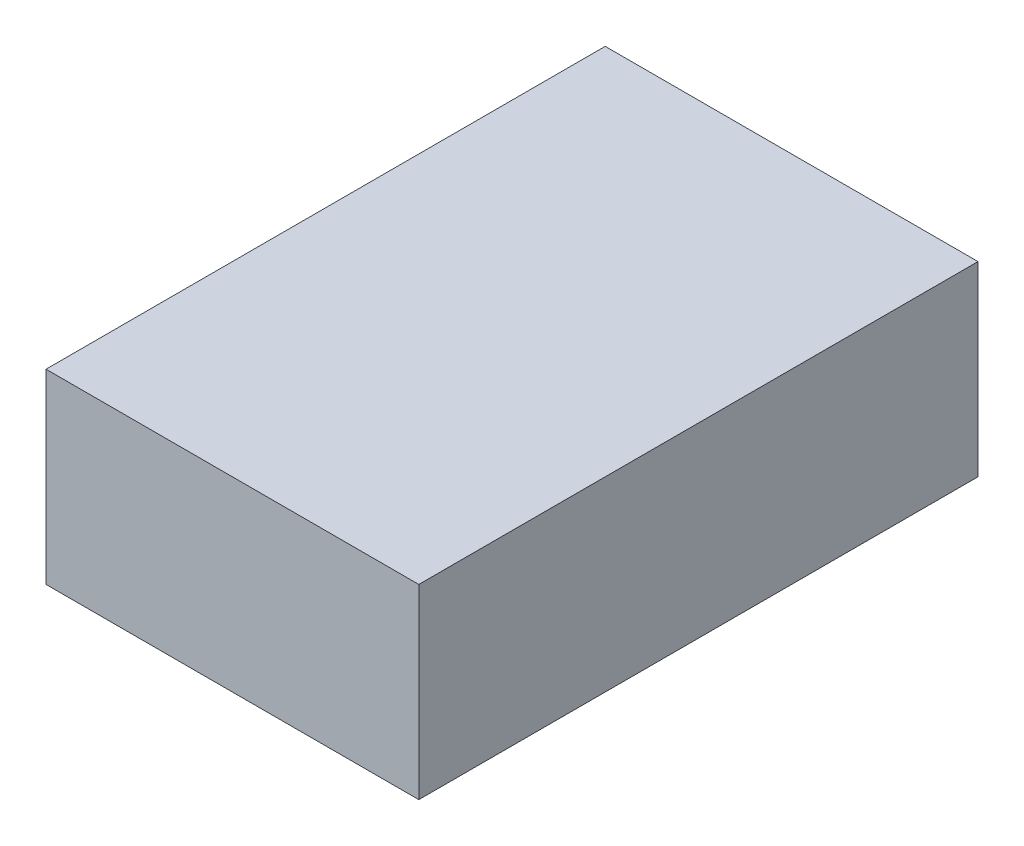
ISO-10303-21;
HEADER;
FILE_DESCRIPTION(('STEP AP214'),'2;1');
FILE_NAME('part.step','',(''),(''),'','','');
FILE_SCHEMA(('AUTOMOTIVE_DESIGN { 1 0 10303 214 1 1 1 1 }'));
ENDSEC;
DATA;
#1=APPLICATION_CONTEXT('core data for automotive mechanical design processes');
#2=APPLICATION_PROTOCOL_DEFINITION('international standard','automotive_design',2000,#1);
#3=PRODUCT_CONTEXT('',#1,'mechanical');
#4=PRODUCT('Part','Part','',(#3));
#5=PRODUCT_RELATED_PRODUCT_CATEGORY('part','',(#4));
#6=PRODUCT_DEFINITION_FORMATION('','',#4);
#7=PRODUCT_DEFINITION_CONTEXT('part definition',#1,'design');
#8=PRODUCT_DEFINITION('design','',#6,#7);
#9=PRODUCT_DEFINITION_SHAPE('','',#8);
#10=(LENGTH_UNIT() NAMED_UNIT(*) SI_UNIT(.MILLI.,.METRE.));
#11=(NAMED_UNIT(*) PLANE_ANGLE_UNIT() SI_UNIT($,.RADIAN.));
#12=(NAMED_UNIT(*) SI_UNIT($,.STERADIAN.) SOLID_ANGLE_UNIT());
#13=UNCERTAINTY_MEASURE_WITH_UNIT(LENGTH_MEASURE(1.E-05),#10,'distance_accuracy_value','');
#14=(GEOMETRIC_REPRESENTATION_CONTEXT(3) GLOBAL_UNCERTAINTY_ASSIGNED_CONTEXT((#13)) GLOBAL_UNIT_ASSIGNED_CONTEXT((#10,
#11,#12)) REPRESENTATION_CONTEXT('',''));
#15=CARTESIAN_POINT('',(0.,0.,0.));
#16=DIRECTION('',(0.,0.,1.));
#17=DIRECTION('',(1.,0.,0.));
#18=AXIS2_PLACEMENT_3D('',#15,#16,#17);
#19=CARTESIAN_POINT('',(-16.1580363402111,10.,-10.8258843479414));
#20=DIRECTION('',(1.,0.,0.));
#21=DIRECTION('',(0.,0.,-1.));
#22=AXIS2_PLACEMENT_3D('',#19,#20,#21);
#23=PLANE('',#22);
#24=DIRECTION('',(0.,0.,1.));
#25=VECTOR('',#24,1.);
#26=CARTESIAN_POINT('',(-16.1580363402111,0.,-10.8258843479414));
#27=LINE('',#26,#25);
#28=CARTESIAN_POINT('',(-16.1580363402111,0.,-10.8258843479414));
#29=VERTEX_POINT('',#28);
#30=CARTESIAN_POINT('',(-16.1580363402111,0.,19.1741156520586));
#31=VERTEX_POINT('',#30);
#32=EDGE_CURVE('E98',#29,#31,#27,.T.);
#33=ORIENTED_EDGE('',*,*,#32,.T.);
#34=DIRECTION('',(0.,-1.,0.));
#35=VECTOR('',#34,1.);
#36=CARTESIAN_POINT('',(-16.1580363402111,10.,19.1741156520586));
#37=LINE('',#36,#35);
#38=CARTESIAN_POINT('',(-16.1580363402111,10.,19.1741156520586));
#39=VERTEX_POINT('',#38);
#40=EDGE_CURVE('E11',#39,#31,#37,.T.);
#41=ORIENTED_EDGE('',*,*,#40,.F.);
#42=DIRECTION('',(0.,0.,1.));
#43=VECTOR('',#42,1.);
#44=CARTESIAN_POINT('',(-16.1580363402111,10.,-10.8258843479414));
#45=LINE('',#44,#43);
#46=CARTESIAN_POINT('',(-16.1580363402111,10.,-10.8258843479414));
#47=VERTEX_POINT('',#46);
#48=EDGE_CURVE('E86',#47,#39,#45,.T.);
#49=ORIENTED_EDGE('',*,*,#48,.F.);
#50=DIRECTION('',(0.,-1.,0.));
#51=VECTOR('',#50,1.);
#52=CARTESIAN_POINT('',(-16.1580363402111,10.,-10.8258843479414));
#53=LINE('',#52,#51);
#54=EDGE_CURVE('E94',#47,#29,#53,.T.);
#55=ORIENTED_EDGE('',*,*,#54,.T.);
#56=EDGE_LOOP('',(#33,#41,#49,#55));
#57=FACE_BOUND('',#56,.T.);
#58=ADVANCED_FACE('F35',(#57),#23,.F.);
#59=CARTESIAN_POINT('',(-16.1580363402111,10.,19.1741156520586));
#60=DIRECTION('',(0.,0.,-1.));
#61=DIRECTION('',(-1.,0.,0.));
#62=AXIS2_PLACEMENT_3D('',#59,#60,#61);
#63=PLANE('',#62);
#64=DIRECTION('',(1.,0.,0.));
#65=VECTOR('',#64,1.);
#66=CARTESIAN_POINT('',(-16.1580363402111,0.,19.1741156520586));
#67=LINE('',#66,#65);
#68=CARTESIAN_POINT('',(3.84196365978894,0.,19.1741156520586));
#69=VERTEX_POINT('',#68);
#70=EDGE_CURVE('E90',#31,#69,#67,.T.);
#71=ORIENTED_EDGE('',*,*,#70,.T.);
#72=DIRECTION('',(0.,-1.,0.));
#73=VECTOR('',#72,1.);
#74=CARTESIAN_POINT('',(3.84196365978894,10.,19.1741156520586));
#75=LINE('',#74,#73);
#76=CARTESIAN_POINT('',(3.84196365978894,10.,19.1741156520586));
#77=VERTEX_POINT('',#76);
#78=EDGE_CURVE('E43',#77,#69,#75,.T.);
#79=ORIENTED_EDGE('',*,*,#78,.F.);
#80=DIRECTION('',(1.,0.,0.));
#81=VECTOR('',#80,1.);
#82=CARTESIAN_POINT('',(-16.1580363402111,10.,19.1741156520586));
#83=LINE('',#82,#81);
#84=EDGE_CURVE('E81',#39,#77,#83,.T.);
#85=ORIENTED_EDGE('',*,*,#84,.F.);
#86=ORIENTED_EDGE('',*,*,#40,.T.);
#87=EDGE_LOOP('',(#71,#79,#85,#86));
#88=FACE_BOUND('',#87,.T.);
#89=ADVANCED_FACE('F89',(#88),#63,.F.);
#90=CARTESIAN_POINT('',(3.84196365978893,10.,-10.8258843479414));
#91=DIRECTION('',(-1.,0.,0.));
#92=DIRECTION('',(0.,0.,1.));
#93=AXIS2_PLACEMENT_3D('',#90,#91,#92);
#94=PLANE('',#93);
#95=DIRECTION('',(0.,0.,-1.));
#96=VECTOR('',#95,1.);
#97=CARTESIAN_POINT('',(3.84196365978893,0.,-10.8258843479414));
#98=LINE('',#97,#96);
#99=CARTESIAN_POINT('',(3.84196365978893,0.,-10.8258843479414));
#100=VERTEX_POINT('',#99);
#101=EDGE_CURVE('E68',#69,#100,#98,.T.);
#102=ORIENTED_EDGE('',*,*,#101,.T.);
#103=DIRECTION('',(0.,-1.,0.));
#104=VECTOR('',#103,1.);
#105=CARTESIAN_POINT('',(3.84196365978893,10.,-10.8258843479414));
#106=LINE('',#105,#104);
#107=CARTESIAN_POINT('',(3.84196365978893,10.,-10.8258843479414));
#108=VERTEX_POINT('',#107);
#109=EDGE_CURVE('E91',#108,#100,#106,.T.);
#110=ORIENTED_EDGE('',*,*,#109,.F.);
#111=DIRECTION('',(0.,0.,-1.));
#112=VECTOR('',#111,1.);
#113=CARTESIAN_POINT('',(3.84196365978893,10.,-10.8258843479414));
#114=LINE('',#113,#112);
#115=EDGE_CURVE('E84',#77,#108,#114,.T.);
#116=ORIENTED_EDGE('',*,*,#115,.F.);
#117=ORIENTED_EDGE('',*,*,#78,.T.);
#118=EDGE_LOOP('',(#102,#110,#116,#117));
#119=FACE_BOUND('',#118,.T.);
#120=ADVANCED_FACE('F92',(#119),#94,.F.);
#121=CARTESIAN_POINT('',(-16.1580363402111,10.,-10.8258843479414));
#122=DIRECTION('',(0.,0.,1.));
#123=DIRECTION('',(1.,0.,0.));
#124=AXIS2_PLACEMENT_3D('',#121,#122,#123);
#125=PLANE('',#124);
#126=DIRECTION('',(-1.,0.,0.));
#127=VECTOR('',#126,1.);
#128=CARTESIAN_POINT('',(-16.1580363402111,0.,-10.8258843479414));
#129=LINE('',#128,#127);
#130=EDGE_CURVE('E74',#100,#29,#129,.T.);
#131=ORIENTED_EDGE('',*,*,#130,.T.);
#132=ORIENTED_EDGE('',*,*,#54,.F.);
#133=DIRECTION('',(-1.,0.,0.));
#134=VECTOR('',#133,1.);
#135=CARTESIAN_POINT('',(-16.1580363402111,10.,-10.8258843479414));
#136=LINE('',#135,#134);
#137=EDGE_CURVE('E51',#108,#47,#136,.T.);
#138=ORIENTED_EDGE('',*,*,#137,.F.);
#139=ORIENTED_EDGE('',*,*,#109,.T.);
#140=EDGE_LOOP('',(#131,#132,#138,#139));
#141=FACE_BOUND('',#140,.T.);
#142=ADVANCED_FACE('F105',(#141),#125,.F.);
#143=CARTESIAN_POINT('',(0.,10.,0.));
#144=DIRECTION('',(0.,1.,0.));
#145=DIRECTION('',(0.,0.,1.));
#146=AXIS2_PLACEMENT_3D('',#143,#144,#145);
#147=PLANE('',#146);
#148=ORIENTED_EDGE('',*,*,#48,.T.);
#149=ORIENTED_EDGE('',*,*,#84,.T.);
#150=ORIENTED_EDGE('',*,*,#115,.T.);
#151=ORIENTED_EDGE('',*,*,#137,.T.);
#152=EDGE_LOOP('',(#148,#149,#150,#151));
#153=FACE_BOUND('',#152,.T.);
#154=ADVANCED_FACE('F82',(#153),#147,.T.);
#155=CARTESIAN_POINT('',(0.,0.,0.));
#156=DIRECTION('',(0.,1.,0.));
#157=DIRECTION('',(0.,0.,1.));
#158=AXIS2_PLACEMENT_3D('',#155,#156,#157);
#159=PLANE('',#158);
#160=ORIENTED_EDGE('',*,*,#32,.F.);
#161=ORIENTED_EDGE('',*,*,#130,.F.);
#162=ORIENTED_EDGE('',*,*,#101,.F.);
#163=ORIENTED_EDGE('',*,*,#70,.F.);
#164=EDGE_LOOP('',(#160,#161,#162,#163));
#165=FACE_BOUND('',#164,.T.);
#166=ADVANCED_FACE('F108',(#165),#159,.F.);
#167=CLOSED_SHELL('',(#58,#89,#120,#142,#154,#166));
#168=MANIFOLD_SOLID_BREP('B2',#167);
#169=ADVANCED_BREP_SHAPE_REPRESENTATION('',(#18,#168),#14);
#170=SHAPE_DEFINITION_REPRESENTATION(#9,#169);
ENDSEC;
END-ISO-10303-21;
